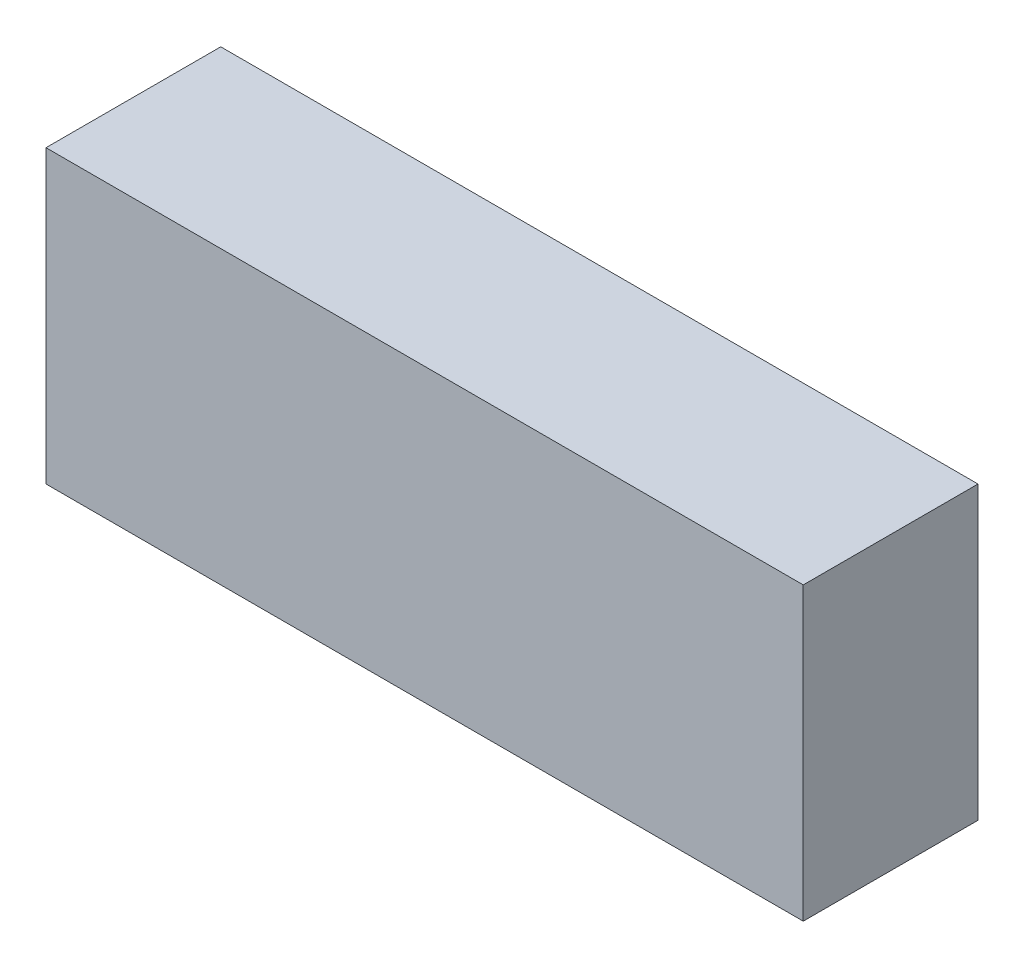
ISO-10303-21;
HEADER;
FILE_DESCRIPTION(('STEP AP214'),'2;1');
FILE_NAME('part.step','',(''),(''),'','','');
FILE_SCHEMA(('AUTOMOTIVE_DESIGN { 1 0 10303 214 1 1 1 1 }'));
ENDSEC;
DATA;
#1=APPLICATION_CONTEXT('core data for automotive mechanical design processes');
#2=APPLICATION_PROTOCOL_DEFINITION('international standard','automotive_design',2000,#1);
#3=PRODUCT_CONTEXT('',#1,'mechanical');
#4=PRODUCT('Part','Part','',(#3));
#5=PRODUCT_RELATED_PRODUCT_CATEGORY('part','',(#4));
#6=PRODUCT_DEFINITION_FORMATION('','',#4);
#7=PRODUCT_DEFINITION_CONTEXT('part definition',#1,'design');
#8=PRODUCT_DEFINITION('design','',#6,#7);
#9=PRODUCT_DEFINITION_SHAPE('','',#8);
#10=(LENGTH_UNIT() NAMED_UNIT(*) SI_UNIT(.MILLI.,.METRE.));
#11=(NAMED_UNIT(*) PLANE_ANGLE_UNIT() SI_UNIT($,.RADIAN.));
#12=(NAMED_UNIT(*) SI_UNIT($,.STERADIAN.) SOLID_ANGLE_UNIT());
#13=UNCERTAINTY_MEASURE_WITH_UNIT(LENGTH_MEASURE(1.E-05),#10,'distance_accuracy_value','');
#14=(GEOMETRIC_REPRESENTATION_CONTEXT(3) GLOBAL_UNCERTAINTY_ASSIGNED_CONTEXT((#13)) GLOBAL_UNIT_ASSIGNED_CONTEXT((#10,
#11,#12)) REPRESENTATION_CONTEXT('',''));
#15=CARTESIAN_POINT('',(0.,0.,0.));
#16=DIRECTION('',(0.,0.,1.));
#17=DIRECTION('',(1.,0.,0.));
#18=AXIS2_PLACEMENT_3D('',#15,#16,#17);
#19=CARTESIAN_POINT('',(0.,0.,3.));
#20=DIRECTION('',(1.,0.,0.));
#21=DIRECTION('',(0.,0.,-1.));
#22=AXIS2_PLACEMENT_3D('',#19,#20,#21);
#23=PLANE('',#22);
#24=DIRECTION('',(0.,-1.,0.));
#25=VECTOR('',#24,1.);
#26=CARTESIAN_POINT('',(0.,0.,0.));
#27=LINE('',#26,#25);
#28=CARTESIAN_POINT('',(0.,5.,0.));
#29=VERTEX_POINT('',#28);
#30=CARTESIAN_POINT('',(0.,0.,0.));
#31=VERTEX_POINT('',#30);
#32=EDGE_CURVE('E96',#29,#31,#27,.T.);
#33=ORIENTED_EDGE('',*,*,#32,.T.);
#34=DIRECTION('',(0.,0.,-1.));
#35=VECTOR('',#34,1.);
#36=CARTESIAN_POINT('',(0.,0.,3.));
#37=LINE('',#36,#35);
#38=CARTESIAN_POINT('',(0.,0.,3.));
#39=VERTEX_POINT('',#38);
#40=EDGE_CURVE('E11',#39,#31,#37,.T.);
#41=ORIENTED_EDGE('',*,*,#40,.F.);
#42=DIRECTION('',(0.,-1.,0.));
#43=VECTOR('',#42,1.);
#44=CARTESIAN_POINT('',(0.,0.,3.));
#45=LINE('',#44,#43);
#46=CARTESIAN_POINT('',(0.,5.,3.));
#47=VERTEX_POINT('',#46);
#48=EDGE_CURVE('E84',#47,#39,#45,.T.);
#49=ORIENTED_EDGE('',*,*,#48,.F.);
#50=DIRECTION('',(0.,0.,-1.));
#51=VECTOR('',#50,1.);
#52=CARTESIAN_POINT('',(0.,5.,3.));
#53=LINE('',#52,#51);
#54=EDGE_CURVE('E92',#47,#29,#53,.T.);
#55=ORIENTED_EDGE('',*,*,#54,.T.);
#56=EDGE_LOOP('',(#33,#41,#49,#55));
#57=FACE_BOUND('',#56,.T.);
#58=ADVANCED_FACE('F33',(#57),#23,.F.);
#59=CARTESIAN_POINT('',(0.,0.,3.));
#60=DIRECTION('',(0.,1.,0.));
#61=DIRECTION('',(0.,0.,1.));
#62=AXIS2_PLACEMENT_3D('',#59,#60,#61);
#63=PLANE('',#62);
#64=DIRECTION('',(1.,0.,0.));
#65=VECTOR('',#64,1.);
#66=CARTESIAN_POINT('',(0.,0.,0.));
#67=LINE('',#66,#65);
#68=CARTESIAN_POINT('',(13.,0.,0.));
#69=VERTEX_POINT('',#68);
#70=EDGE_CURVE('E88',#31,#69,#67,.T.);
#71=ORIENTED_EDGE('',*,*,#70,.T.);
#72=DIRECTION('',(0.,0.,-1.));
#73=VECTOR('',#72,1.);
#74=CARTESIAN_POINT('',(13.,0.,3.));
#75=LINE('',#74,#73);
#76=CARTESIAN_POINT('',(13.,0.,3.));
#77=VERTEX_POINT('',#76);
#78=EDGE_CURVE('E41',#77,#69,#75,.T.);
#79=ORIENTED_EDGE('',*,*,#78,.F.);
#80=DIRECTION('',(1.,0.,0.));
#81=VECTOR('',#80,1.);
#82=CARTESIAN_POINT('',(0.,0.,3.));
#83=LINE('',#82,#81);
#84=EDGE_CURVE('E79',#39,#77,#83,.T.);
#85=ORIENTED_EDGE('',*,*,#84,.F.);
#86=ORIENTED_EDGE('',*,*,#40,.T.);
#87=EDGE_LOOP('',(#71,#79,#85,#86));
#88=FACE_BOUND('',#87,.T.);
#89=ADVANCED_FACE('F87',(#88),#63,.F.);
#90=CARTESIAN_POINT('',(13.,0.,3.));
#91=DIRECTION('',(-1.,0.,0.));
#92=DIRECTION('',(0.,0.,1.));
#93=AXIS2_PLACEMENT_3D('',#90,#91,#92);
#94=PLANE('',#93);
#95=DIRECTION('',(0.,1.,0.));
#96=VECTOR('',#95,1.);
#97=CARTESIAN_POINT('',(13.,0.,0.));
#98=LINE('',#97,#96);
#99=CARTESIAN_POINT('',(13.,5.,0.));
#100=VERTEX_POINT('',#99);
#101=EDGE_CURVE('E66',#69,#100,#98,.T.);
#102=ORIENTED_EDGE('',*,*,#101,.T.);
#103=DIRECTION('',(0.,0.,-1.));
#104=VECTOR('',#103,1.);
#105=CARTESIAN_POINT('',(13.,5.,3.));
#106=LINE('',#105,#104);
#107=CARTESIAN_POINT('',(13.,5.,3.));
#108=VERTEX_POINT('',#107);
#109=EDGE_CURVE('E89',#108,#100,#106,.T.);
#110=ORIENTED_EDGE('',*,*,#109,.F.);
#111=DIRECTION('',(0.,1.,0.));
#112=VECTOR('',#111,1.);
#113=CARTESIAN_POINT('',(13.,0.,3.));
#114=LINE('',#113,#112);
#115=EDGE_CURVE('E82',#77,#108,#114,.T.);
#116=ORIENTED_EDGE('',*,*,#115,.F.);
#117=ORIENTED_EDGE('',*,*,#78,.T.);
#118=EDGE_LOOP('',(#102,#110,#116,#117));
#119=FACE_BOUND('',#118,.T.);
#120=ADVANCED_FACE('F90',(#119),#94,.F.);
#121=CARTESIAN_POINT('',(0.,5.,3.));
#122=DIRECTION('',(0.,-1.,0.));
#123=DIRECTION('',(0.,0.,-1.));
#124=AXIS2_PLACEMENT_3D('',#121,#122,#123);
#125=PLANE('',#124);
#126=DIRECTION('',(-1.,0.,0.));
#127=VECTOR('',#126,1.);
#128=CARTESIAN_POINT('',(0.,5.,0.));
#129=LINE('',#128,#127);
#130=EDGE_CURVE('E72',#100,#29,#129,.T.);
#131=ORIENTED_EDGE('',*,*,#130,.T.);
#132=ORIENTED_EDGE('',*,*,#54,.F.);
#133=DIRECTION('',(-1.,0.,0.));
#134=VECTOR('',#133,1.);
#135=CARTESIAN_POINT('',(0.,5.,3.));
#136=LINE('',#135,#134);
#137=EDGE_CURVE('E49',#108,#47,#136,.T.);
#138=ORIENTED_EDGE('',*,*,#137,.F.);
#139=ORIENTED_EDGE('',*,*,#109,.T.);
#140=EDGE_LOOP('',(#131,#132,#138,#139));
#141=FACE_BOUND('',#140,.T.);
#142=ADVANCED_FACE('F103',(#141),#125,.F.);
#143=CARTESIAN_POINT('',(0.,0.,3.));
#144=DIRECTION('',(0.,0.,-1.));
#145=DIRECTION('',(-1.,0.,0.));
#146=AXIS2_PLACEMENT_3D('',#143,#144,#145);
#147=PLANE('',#146);
#148=ORIENTED_EDGE('',*,*,#48,.T.);
#149=ORIENTED_EDGE('',*,*,#84,.T.);
#150=ORIENTED_EDGE('',*,*,#115,.T.);
#151=ORIENTED_EDGE('',*,*,#137,.T.);
#152=EDGE_LOOP('',(#148,#149,#150,#151));
#153=FACE_BOUND('',#152,.T.);
#154=ADVANCED_FACE('F80',(#153),#147,.F.);
#155=CARTESIAN_POINT('',(0.,0.,0.));
#156=DIRECTION('',(0.,0.,-1.));
#157=DIRECTION('',(-1.,0.,0.));
#158=AXIS2_PLACEMENT_3D('',#155,#156,#157);
#159=PLANE('',#158);
#160=ORIENTED_EDGE('',*,*,#32,.F.);
#161=ORIENTED_EDGE('',*,*,#130,.F.);
#162=ORIENTED_EDGE('',*,*,#101,.F.);
#163=ORIENTED_EDGE('',*,*,#70,.F.);
#164=EDGE_LOOP('',(#160,#161,#162,#163));
#165=FACE_BOUND('',#164,.T.);
#166=ADVANCED_FACE('F106',(#165),#159,.T.);
#167=CLOSED_SHELL('',(#58,#89,#120,#142,#154,#166));
#168=MANIFOLD_SOLID_BREP('B2',#167);
#169=ADVANCED_BREP_SHAPE_REPRESENTATION('',(#18,#168),#14);
#170=SHAPE_DEFINITION_REPRESENTATION(#9,#169);
ENDSEC;
END-ISO-10303-21;
